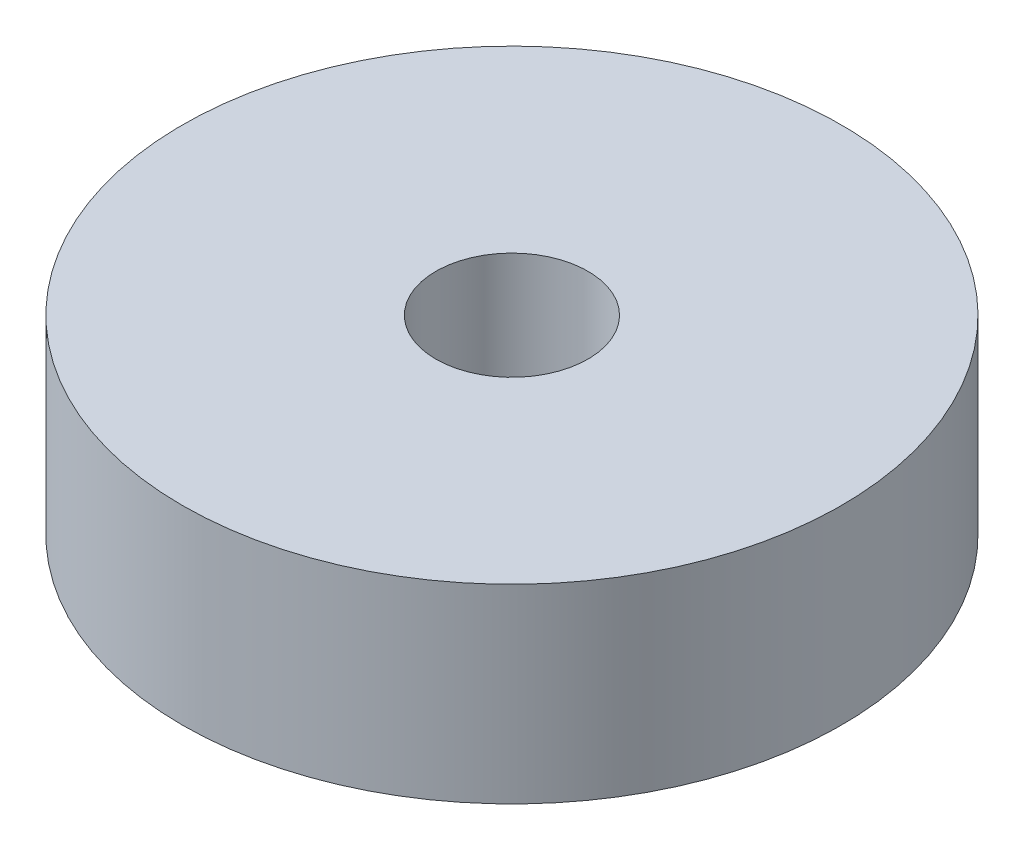
ISO-10303-21;
HEADER;
FILE_DESCRIPTION(('STEP AP214'),'2;1');
FILE_NAME('part.step','',(''),(''),'','','');
FILE_SCHEMA(('AUTOMOTIVE_DESIGN { 1 0 10303 214 1 1 1 1 }'));
ENDSEC;
DATA;
#1=APPLICATION_CONTEXT('core data for automotive mechanical design processes');
#2=APPLICATION_PROTOCOL_DEFINITION('international standard','automotive_design',2000,#1);
#3=PRODUCT_CONTEXT('',#1,'mechanical');
#4=PRODUCT('Part','Part','',(#3));
#5=PRODUCT_RELATED_PRODUCT_CATEGORY('part','',(#4));
#6=PRODUCT_DEFINITION_FORMATION('','',#4);
#7=PRODUCT_DEFINITION_CONTEXT('part definition',#1,'design');
#8=PRODUCT_DEFINITION('design','',#6,#7);
#9=PRODUCT_DEFINITION_SHAPE('','',#8);
#10=(LENGTH_UNIT() NAMED_UNIT(*) SI_UNIT(.MILLI.,.METRE.));
#11=(NAMED_UNIT(*) PLANE_ANGLE_UNIT() SI_UNIT($,.RADIAN.));
#12=(NAMED_UNIT(*) SI_UNIT($,.STERADIAN.) SOLID_ANGLE_UNIT());
#13=UNCERTAINTY_MEASURE_WITH_UNIT(LENGTH_MEASURE(1.E-05),#10,'distance_accuracy_value','');
#14=(GEOMETRIC_REPRESENTATION_CONTEXT(3) GLOBAL_UNCERTAINTY_ASSIGNED_CONTEXT((#13)) GLOBAL_UNIT_ASSIGNED_CONTEXT((#10,
#11,#12)) REPRESENTATION_CONTEXT('',''));
#15=CARTESIAN_POINT('',(0.,0.,0.));
#16=DIRECTION('',(0.,0.,1.));
#17=DIRECTION('',(1.,0.,0.));
#18=AXIS2_PLACEMENT_3D('',#15,#16,#17);
#19=CARTESIAN_POINT('',(0.,6.35,0.));
#20=DIRECTION('',(0.,1.,0.));
#21=DIRECTION('',(0.,0.,1.));
#22=AXIS2_PLACEMENT_3D('',#19,#20,#21);
#23=PLANE('',#22);
#24=CARTESIAN_POINT('',(0.,6.35,0.));
#25=DIRECTION('',(0.,1.,0.));
#26=DIRECTION('',(0.,0.,1.));
#27=AXIS2_PLACEMENT_3D('',#24,#25,#26);
#28=CIRCLE('',#27,11.);
#29=CARTESIAN_POINT('',(0.,6.35,11.));
#30=VERTEX_POINT('',#29);
#31=EDGE_CURVE('E10',#30,#30,#28,.T.);
#32=ORIENTED_EDGE('',*,*,#31,.T.);
#33=EDGE_LOOP('',(#32));
#34=FACE_BOUND('',#33,.T.);
#35=CARTESIAN_POINT('',(0.,6.35,0.));
#36=DIRECTION('',(0.,1.,0.));
#37=DIRECTION('',(0.,0.,1.));
#38=AXIS2_PLACEMENT_3D('',#35,#36,#37);
#39=CIRCLE('',#38,2.54);
#40=CARTESIAN_POINT('',(0.,6.35,2.54));
#41=VERTEX_POINT('',#40);
#42=EDGE_CURVE('E41',#41,#41,#39,.T.);
#43=ORIENTED_EDGE('',*,*,#42,.F.);
#44=EDGE_LOOP('',(#43));
#45=FACE_BOUND('',#44,.T.);
#46=ADVANCED_FACE('F30',(#34,#45),#23,.T.);
#47=CARTESIAN_POINT('',(0.,0.,0.));
#48=DIRECTION('',(0.,1.,0.));
#49=DIRECTION('',(0.,0.,1.));
#50=AXIS2_PLACEMENT_3D('',#47,#48,#49);
#51=PLANE('',#50);
#52=CARTESIAN_POINT('',(0.,0.,0.));
#53=DIRECTION('',(0.,1.,0.));
#54=DIRECTION('',(0.,0.,1.));
#55=AXIS2_PLACEMENT_3D('',#52,#53,#54);
#56=CIRCLE('',#55,11.);
#57=CARTESIAN_POINT('',(0.,0.,11.));
#58=VERTEX_POINT('',#57);
#59=EDGE_CURVE('E34',#58,#58,#56,.T.);
#60=ORIENTED_EDGE('',*,*,#59,.F.);
#61=EDGE_LOOP('',(#60));
#62=FACE_BOUND('',#61,.T.);
#63=CARTESIAN_POINT('',(0.,0.,0.));
#64=DIRECTION('',(0.,1.,0.));
#65=DIRECTION('',(0.,0.,1.));
#66=AXIS2_PLACEMENT_3D('',#63,#64,#65);
#67=CIRCLE('',#66,2.54);
#68=CARTESIAN_POINT('',(0.,0.,2.54));
#69=VERTEX_POINT('',#68);
#70=EDGE_CURVE('E43',#69,#69,#67,.T.);
#71=ORIENTED_EDGE('',*,*,#70,.T.);
#72=EDGE_LOOP('',(#71));
#73=FACE_BOUND('',#72,.T.);
#74=ADVANCED_FACE('F53',(#62,#73),#51,.F.);
#75=CARTESIAN_POINT('',(0.,6.35,0.));
#76=DIRECTION('',(0.,-1.,0.));
#77=DIRECTION('',(0.,0.,-1.));
#78=AXIS2_PLACEMENT_3D('',#75,#76,#77);
#79=CYLINDRICAL_SURFACE('',#78,11.);
#80=ORIENTED_EDGE('',*,*,#31,.F.);
#81=EDGE_LOOP('',(#80));
#82=FACE_BOUND('',#81,.T.);
#83=ORIENTED_EDGE('',*,*,#59,.T.);
#84=EDGE_LOOP('',(#83));
#85=FACE_BOUND('',#84,.T.);
#86=ADVANCED_FACE('F32',(#82,#85),#79,.T.);
#87=CARTESIAN_POINT('',(0.,6.35,0.));
#88=DIRECTION('',(0.,-1.,0.));
#89=DIRECTION('',(0.,0.,-1.));
#90=AXIS2_PLACEMENT_3D('',#87,#88,#89);
#91=CYLINDRICAL_SURFACE('',#90,2.54);
#92=ORIENTED_EDGE('',*,*,#42,.T.);
#93=EDGE_LOOP('',(#92));
#94=FACE_BOUND('',#93,.T.);
#95=ORIENTED_EDGE('',*,*,#70,.F.);
#96=EDGE_LOOP('',(#95));
#97=FACE_BOUND('',#96,.T.);
#98=ADVANCED_FACE('F49',(#94,#97),#91,.F.);
#99=CLOSED_SHELL('',(#46,#74,#86,#98));
#100=MANIFOLD_SOLID_BREP('B2',#99);
#101=ADVANCED_BREP_SHAPE_REPRESENTATION('',(#18,#100),#14);
#102=SHAPE_DEFINITION_REPRESENTATION(#9,#101);
ENDSEC;
END-ISO-10303-21;
